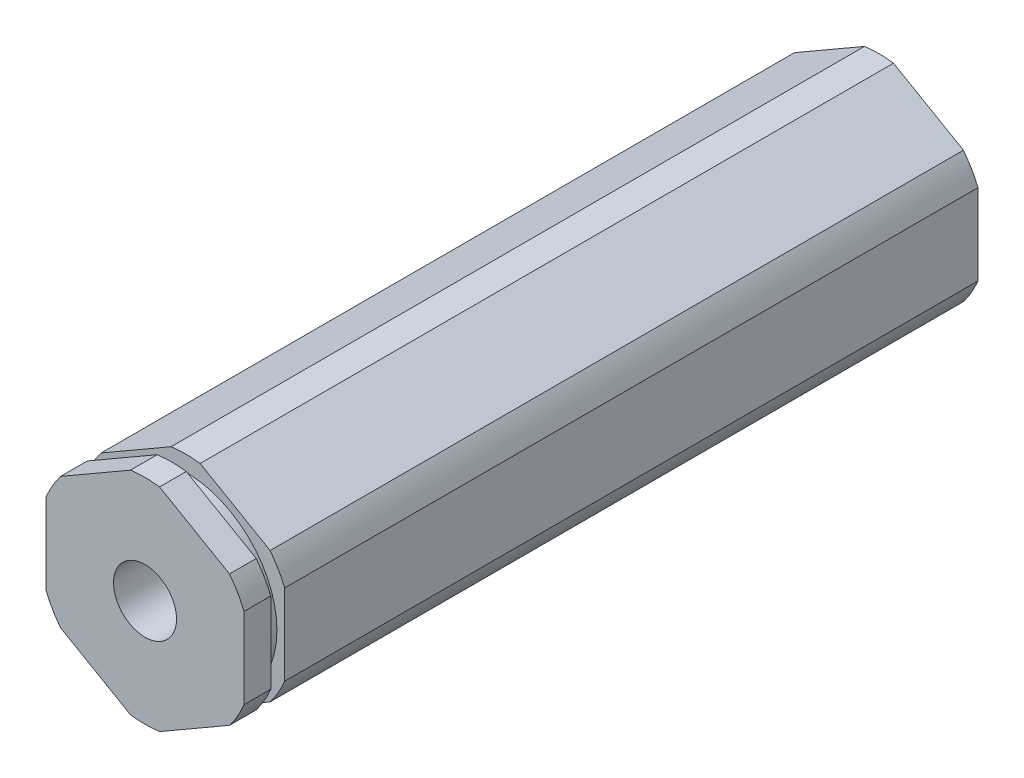
ISO-10303-21;
HEADER;
FILE_DESCRIPTION(('STEP AP214'),'2;1');
FILE_NAME('part.step','',(''),(''),'','','');
FILE_SCHEMA(('AUTOMOTIVE_DESIGN { 1 0 10303 214 1 1 1 1 }'));
ENDSEC;
DATA;
#1=APPLICATION_CONTEXT('core data for automotive mechanical design processes');
#2=APPLICATION_PROTOCOL_DEFINITION('international standard','automotive_design',2000,#1);
#3=PRODUCT_CONTEXT('',#1,'mechanical');
#4=PRODUCT('Part','Part','',(#3));
#5=PRODUCT_RELATED_PRODUCT_CATEGORY('part','',(#4));
#6=PRODUCT_DEFINITION_FORMATION('','',#4);
#7=PRODUCT_DEFINITION_CONTEXT('part definition',#1,'design');
#8=PRODUCT_DEFINITION('design','',#6,#7);
#9=PRODUCT_DEFINITION_SHAPE('','',#8);
#10=(LENGTH_UNIT() NAMED_UNIT(*) SI_UNIT(.MILLI.,.METRE.));
#11=(NAMED_UNIT(*) PLANE_ANGLE_UNIT() SI_UNIT($,.RADIAN.));
#12=(NAMED_UNIT(*) SI_UNIT($,.STERADIAN.) SOLID_ANGLE_UNIT());
#13=UNCERTAINTY_MEASURE_WITH_UNIT(LENGTH_MEASURE(1.E-05),#10,'distance_accuracy_value','');
#14=(GEOMETRIC_REPRESENTATION_CONTEXT(3) GLOBAL_UNCERTAINTY_ASSIGNED_CONTEXT((#13)) GLOBAL_UNIT_ASSIGNED_CONTEXT((#10,
#11,#12)) REPRESENTATION_CONTEXT('',''));
#15=CARTESIAN_POINT('',(0.,0.,0.));
#16=DIRECTION('',(0.,0.,1.));
#17=DIRECTION('',(1.,0.,0.));
#18=AXIS2_PLACEMENT_3D('',#15,#16,#17);
#19=CARTESIAN_POINT('',(6.35,0.,23.5331));
#20=DIRECTION('',(-1.,0.,0.));
#21=DIRECTION('',(0.,-1.,0.));
#22=AXIS2_PLACEMENT_3D('',#19,#20,#21);
#23=PLANE('',#22);
#24=DIRECTION('',(0.,-1.,0.));
#25=VECTOR('',#24,1.);
#26=CARTESIAN_POINT('',(6.35,0.,21.8186));
#27=LINE('',#26,#25);
#28=CARTESIAN_POINT('',(6.35,2.59030191290513,21.8186));
#29=VERTEX_POINT('',#28);
#30=CARTESIAN_POINT('',(6.35,-2.59030191290513,21.8186));
#31=VERTEX_POINT('',#30);
#32=EDGE_CURVE('E80',#29,#31,#27,.T.);
#33=ORIENTED_EDGE('',*,*,#32,.F.);
#34=DIRECTION('',(0.,0.,-1.));
#35=VECTOR('',#34,1.);
#36=CARTESIAN_POINT('',(6.35,2.59030191290513,23.5331));
#37=LINE('',#36,#35);
#38=CARTESIAN_POINT('',(6.35,2.59030191290513,23.5331));
#39=VERTEX_POINT('',#38);
#40=EDGE_CURVE('E251',#39,#29,#37,.T.);
#41=ORIENTED_EDGE('',*,*,#40,.F.);
#42=DIRECTION('',(0.,1.,0.));
#43=VECTOR('',#42,1.);
#44=CARTESIAN_POINT('',(6.35,0.,23.5331));
#45=LINE('',#44,#43);
#46=CARTESIAN_POINT('',(6.35,-2.59030191290513,23.5331));
#47=VERTEX_POINT('',#46);
#48=EDGE_CURVE('E365',#47,#39,#45,.T.);
#49=ORIENTED_EDGE('',*,*,#48,.F.);
#50=DIRECTION('',(0.,0.,-1.));
#51=VECTOR('',#50,1.);
#52=CARTESIAN_POINT('',(6.35,-2.59030191290513,23.5331));
#53=LINE('',#52,#51);
#54=EDGE_CURVE('E306',#47,#31,#53,.T.);
#55=ORIENTED_EDGE('',*,*,#54,.T.);
#56=EDGE_LOOP('',(#33,#41,#49,#55));
#57=FACE_BOUND('',#56,.T.);
#58=ADVANCED_FACE('F58',(#57),#23,.F.);
#59=CARTESIAN_POINT('',(0.,0.,23.5331));
#60=DIRECTION('',(0.,0.,-1.));
#61=DIRECTION('',(-1.,0.,0.));
#62=AXIS2_PLACEMENT_3D('',#59,#60,#61);
#63=CYLINDRICAL_SURFACE('',#62,6.858);
#64=CARTESIAN_POINT('',(0.,0.,21.8186));
#65=DIRECTION('',(0.,0.,1.));
#66=DIRECTION('',(1.,0.,0.));
#67=AXIS2_PLACEMENT_3D('',#64,#65,#66);
#68=CIRCLE('',#67,6.858);
#69=CARTESIAN_POINT('',(5.41826726004727,4.20411035757862,21.8186));
#70=VERTEX_POINT('',#69);
#71=EDGE_CURVE('E420',#29,#70,#68,.T.);
#72=ORIENTED_EDGE('',*,*,#71,.T.);
#73=DIRECTION('',(0.,0.,-1.));
#74=VECTOR('',#73,1.);
#75=CARTESIAN_POINT('',(5.41826726004727,4.20411035757862,23.5331));
#76=LINE('',#75,#74);
#77=CARTESIAN_POINT('',(5.41826726004727,4.20411035757862,23.5331));
#78=VERTEX_POINT('',#77);
#79=EDGE_CURVE('E252',#78,#70,#76,.T.);
#80=ORIENTED_EDGE('',*,*,#79,.F.);
#81=CARTESIAN_POINT('',(0.,0.,23.5331));
#82=DIRECTION('',(0.,0.,1.));
#83=DIRECTION('',(1.,0.,0.));
#84=AXIS2_PLACEMENT_3D('',#81,#82,#83);
#85=CIRCLE('',#84,6.858);
#86=EDGE_CURVE('E362',#39,#78,#85,.T.);
#87=ORIENTED_EDGE('',*,*,#86,.F.);
#88=ORIENTED_EDGE('',*,*,#40,.T.);
#89=EDGE_LOOP('',(#72,#80,#87,#88));
#90=FACE_BOUND('',#89,.T.);
#91=ADVANCED_FACE('F550',(#90),#63,.T.);
#92=CARTESIAN_POINT('',(3.175,5.49926131403119,23.5331));
#93=DIRECTION('',(-0.5,-0.866025403784439,0.));
#94=DIRECTION('',(0.866025403784439,-0.5,0.));
#95=AXIS2_PLACEMENT_3D('',#92,#93,#94);
#96=PLANE('',#95);
#97=DIRECTION('',(0.866025403784439,-0.5,0.));
#98=VECTOR('',#97,1.);
#99=CARTESIAN_POINT('',(3.175,5.49926131403119,21.8186));
#100=LINE('',#99,#98);
#101=CARTESIAN_POINT('',(0.931732739952733,6.79441227048375,21.8186));
#102=VERTEX_POINT('',#101);
#103=EDGE_CURVE('E386',#102,#70,#100,.T.);
#104=ORIENTED_EDGE('',*,*,#103,.F.);
#105=DIRECTION('',(0.,0.,-1.));
#106=VECTOR('',#105,1.);
#107=CARTESIAN_POINT('',(0.931732739952733,6.79441227048375,23.5331));
#108=LINE('',#107,#106);
#109=CARTESIAN_POINT('',(0.931732739952733,6.79441227048375,23.5331));
#110=VERTEX_POINT('',#109);
#111=EDGE_CURVE('E261',#110,#102,#108,.T.);
#112=ORIENTED_EDGE('',*,*,#111,.F.);
#113=DIRECTION('',(-0.866025403784439,0.5,0.));
#114=VECTOR('',#113,1.);
#115=CARTESIAN_POINT('',(3.175,5.49926131403119,23.5331));
#116=LINE('',#115,#114);
#117=EDGE_CURVE('E359',#78,#110,#116,.T.);
#118=ORIENTED_EDGE('',*,*,#117,.F.);
#119=ORIENTED_EDGE('',*,*,#79,.T.);
#120=EDGE_LOOP('',(#104,#112,#118,#119));
#121=FACE_BOUND('',#120,.T.);
#122=ADVANCED_FACE('F562',(#121),#96,.F.);
#123=CARTESIAN_POINT('',(-0.931732739952733,6.79441227048375,21.8186));
#124=VERTEX_POINT('',#123);
#125=EDGE_CURVE('E423',#102,#124,#68,.T.);
#126=ORIENTED_EDGE('',*,*,#125,.T.);
#127=DIRECTION('',(0.,0.,-1.));
#128=VECTOR('',#127,1.);
#129=CARTESIAN_POINT('',(-0.931732739952731,6.79441227048375,23.5331));
#130=LINE('',#129,#128);
#131=CARTESIAN_POINT('',(-0.931732739952731,6.79441227048375,23.5331));
#132=VERTEX_POINT('',#131);
#133=EDGE_CURVE('E266',#132,#124,#130,.T.);
#134=ORIENTED_EDGE('',*,*,#133,.F.);
#135=EDGE_CURVE('E358',#110,#132,#85,.T.);
#136=ORIENTED_EDGE('',*,*,#135,.F.);
#137=ORIENTED_EDGE('',*,*,#111,.T.);
#138=EDGE_LOOP('',(#126,#134,#136,#137));
#139=FACE_BOUND('',#138,.T.);
#140=ADVANCED_FACE('F567',(#139),#63,.T.);
#141=CARTESIAN_POINT('',(-3.175,5.49926131403119,23.5331));
#142=DIRECTION('',(0.5,-0.866025403784439,0.));
#143=DIRECTION('',(0.866025403784439,0.5,0.));
#144=AXIS2_PLACEMENT_3D('',#141,#142,#143);
#145=PLANE('',#144);
#146=DIRECTION('',(0.866025403784439,0.5,0.));
#147=VECTOR('',#146,1.);
#148=CARTESIAN_POINT('',(-3.175,5.49926131403119,21.8186));
#149=LINE('',#148,#147);
#150=CARTESIAN_POINT('',(-5.41826726004727,4.20411035757862,21.8186));
#151=VERTEX_POINT('',#150);
#152=EDGE_CURVE('E389',#151,#124,#149,.T.);
#153=ORIENTED_EDGE('',*,*,#152,.F.);
#154=DIRECTION('',(0.,0.,-1.));
#155=VECTOR('',#154,1.);
#156=CARTESIAN_POINT('',(-5.41826726004727,4.20411035757862,23.5331));
#157=LINE('',#156,#155);
#158=CARTESIAN_POINT('',(-5.41826726004727,4.20411035757862,23.5331));
#159=VERTEX_POINT('',#158);
#160=EDGE_CURVE('E271',#159,#151,#157,.T.);
#161=ORIENTED_EDGE('',*,*,#160,.F.);
#162=DIRECTION('',(-0.866025403784439,-0.5,0.));
#163=VECTOR('',#162,1.);
#164=CARTESIAN_POINT('',(-3.175,5.49926131403119,23.5331));
#165=LINE('',#164,#163);
#166=EDGE_CURVE('E355',#132,#159,#165,.T.);
#167=ORIENTED_EDGE('',*,*,#166,.F.);
#168=ORIENTED_EDGE('',*,*,#133,.T.);
#169=EDGE_LOOP('',(#153,#161,#167,#168));
#170=FACE_BOUND('',#169,.T.);
#171=ADVANCED_FACE('F572',(#170),#145,.F.);
#172=CARTESIAN_POINT('',(-6.35,2.59030191290514,21.8186));
#173=VERTEX_POINT('',#172);
#174=EDGE_CURVE('E431',#151,#173,#68,.T.);
#175=ORIENTED_EDGE('',*,*,#174,.T.);
#176=DIRECTION('',(0.,0.,-1.));
#177=VECTOR('',#176,1.);
#178=CARTESIAN_POINT('',(-6.35,2.59030191290514,23.5331));
#179=LINE('',#178,#177);
#180=CARTESIAN_POINT('',(-6.35,2.59030191290514,23.5331));
#181=VERTEX_POINT('',#180);
#182=EDGE_CURVE('E276',#181,#173,#179,.T.);
#183=ORIENTED_EDGE('',*,*,#182,.F.);
#184=EDGE_CURVE('E354',#159,#181,#85,.T.);
#185=ORIENTED_EDGE('',*,*,#184,.F.);
#186=ORIENTED_EDGE('',*,*,#160,.T.);
#187=EDGE_LOOP('',(#175,#183,#185,#186));
#188=FACE_BOUND('',#187,.T.);
#189=ADVANCED_FACE('F445',(#188),#63,.T.);
#190=CARTESIAN_POINT('',(-6.35,0.,23.5331));
#191=DIRECTION('',(1.,0.,0.));
#192=DIRECTION('',(0.,1.,0.));
#193=AXIS2_PLACEMENT_3D('',#190,#191,#192);
#194=PLANE('',#193);
#195=DIRECTION('',(0.,1.,0.));
#196=VECTOR('',#195,1.);
#197=CARTESIAN_POINT('',(-6.35,0.,21.8186));
#198=LINE('',#197,#196);
#199=CARTESIAN_POINT('',(-6.35,-2.59030191290514,21.8186));
#200=VERTEX_POINT('',#199);
#201=EDGE_CURVE('E392',#200,#173,#198,.T.);
#202=ORIENTED_EDGE('',*,*,#201,.F.);
#203=DIRECTION('',(0.,0.,-1.));
#204=VECTOR('',#203,1.);
#205=CARTESIAN_POINT('',(-6.35,-2.59030191290514,23.5331));
#206=LINE('',#205,#204);
#207=CARTESIAN_POINT('',(-6.35,-2.59030191290514,23.5331));
#208=VERTEX_POINT('',#207);
#209=EDGE_CURVE('E281',#208,#200,#206,.T.);
#210=ORIENTED_EDGE('',*,*,#209,.F.);
#211=DIRECTION('',(0.,-1.,0.));
#212=VECTOR('',#211,1.);
#213=CARTESIAN_POINT('',(-6.35,0.,23.5331));
#214=LINE('',#213,#212);
#215=EDGE_CURVE('E351',#181,#208,#214,.T.);
#216=ORIENTED_EDGE('',*,*,#215,.F.);
#217=ORIENTED_EDGE('',*,*,#182,.T.);
#218=EDGE_LOOP('',(#202,#210,#216,#217));
#219=FACE_BOUND('',#218,.T.);
#220=ADVANCED_FACE('F452',(#219),#194,.F.);
#221=CARTESIAN_POINT('',(-5.41826726004728,-4.20411035757861,21.8186));
#222=VERTEX_POINT('',#221);
#223=EDGE_CURVE('E434',#200,#222,#68,.T.);
#224=ORIENTED_EDGE('',*,*,#223,.T.);
#225=DIRECTION('',(0.,0.,-1.));
#226=VECTOR('',#225,1.);
#227=CARTESIAN_POINT('',(-5.41826726004728,-4.20411035757862,23.5331));
#228=LINE('',#227,#226);
#229=CARTESIAN_POINT('',(-5.41826726004728,-4.20411035757862,23.5331));
#230=VERTEX_POINT('',#229);
#231=EDGE_CURVE('E286',#230,#222,#228,.T.);
#232=ORIENTED_EDGE('',*,*,#231,.F.);
#233=EDGE_CURVE('E350',#208,#230,#85,.T.);
#234=ORIENTED_EDGE('',*,*,#233,.F.);
#235=ORIENTED_EDGE('',*,*,#209,.T.);
#236=EDGE_LOOP('',(#224,#232,#234,#235));
#237=FACE_BOUND('',#236,.T.);
#238=ADVANCED_FACE('F541',(#237),#63,.T.);
#239=CARTESIAN_POINT('',(-3.175,-5.49926131403118,23.5331));
#240=DIRECTION('',(0.5,0.866025403784439,0.));
#241=DIRECTION('',(-0.866025403784439,0.5,0.));
#242=AXIS2_PLACEMENT_3D('',#239,#240,#241);
#243=PLANE('',#242);
#244=DIRECTION('',(-0.866025403784439,0.5,0.));
#245=VECTOR('',#244,1.);
#246=CARTESIAN_POINT('',(-3.175,-5.49926131403118,21.8186));
#247=LINE('',#246,#245);
#248=CARTESIAN_POINT('',(-0.931732739952721,-6.79441227048375,21.8186));
#249=VERTEX_POINT('',#248);
#250=EDGE_CURVE('E395',#249,#222,#247,.T.);
#251=ORIENTED_EDGE('',*,*,#250,.F.);
#252=DIRECTION('',(0.,0.,-1.));
#253=VECTOR('',#252,1.);
#254=CARTESIAN_POINT('',(-0.931732739952721,-6.79441227048375,23.5331));
#255=LINE('',#254,#253);
#256=CARTESIAN_POINT('',(-0.931732739952721,-6.79441227048375,23.5331));
#257=VERTEX_POINT('',#256);
#258=EDGE_CURVE('E291',#257,#249,#255,.T.);
#259=ORIENTED_EDGE('',*,*,#258,.F.);
#260=DIRECTION('',(0.866025403784439,-0.5,0.));
#261=VECTOR('',#260,1.);
#262=CARTESIAN_POINT('',(-3.175,-5.49926131403118,23.5331));
#263=LINE('',#262,#261);
#264=EDGE_CURVE('E347',#230,#257,#263,.T.);
#265=ORIENTED_EDGE('',*,*,#264,.F.);
#266=ORIENTED_EDGE('',*,*,#231,.T.);
#267=EDGE_LOOP('',(#251,#259,#265,#266));
#268=FACE_BOUND('',#267,.T.);
#269=ADVANCED_FACE('F549',(#268),#243,.F.);
#270=CARTESIAN_POINT('',(0.931732739952728,-6.79441227048375,21.8186));
#271=VERTEX_POINT('',#270);
#272=EDGE_CURVE('E424',#249,#271,#68,.T.);
#273=ORIENTED_EDGE('',*,*,#272,.T.);
#274=DIRECTION('',(0.,0.,-1.));
#275=VECTOR('',#274,1.);
#276=CARTESIAN_POINT('',(0.931732739952731,-6.79441227048375,23.5331));
#277=LINE('',#276,#275);
#278=CARTESIAN_POINT('',(0.931732739952731,-6.79441227048375,23.5331));
#279=VERTEX_POINT('',#278);
#280=EDGE_CURVE('E296',#279,#271,#277,.T.);
#281=ORIENTED_EDGE('',*,*,#280,.F.);
#282=EDGE_CURVE('E346',#257,#279,#85,.T.);
#283=ORIENTED_EDGE('',*,*,#282,.F.);
#284=ORIENTED_EDGE('',*,*,#258,.T.);
#285=EDGE_LOOP('',(#273,#281,#283,#284));
#286=FACE_BOUND('',#285,.T.);
#287=ADVANCED_FACE('F540',(#286),#63,.T.);
#288=CARTESIAN_POINT('',(3.175,-5.49926131403118,23.5331));
#289=DIRECTION('',(-0.5,0.866025403784439,0.));
#290=DIRECTION('',(-0.866025403784439,-0.5,0.));
#291=AXIS2_PLACEMENT_3D('',#288,#289,#290);
#292=PLANE('',#291);
#293=DIRECTION('',(-0.866025403784439,-0.5,0.));
#294=VECTOR('',#293,1.);
#295=CARTESIAN_POINT('',(3.175,-5.49926131403118,21.8186));
#296=LINE('',#295,#294);
#297=CARTESIAN_POINT('',(5.41826726004727,-4.20411035757862,21.8186));
#298=VERTEX_POINT('',#297);
#299=EDGE_CURVE('E231',#298,#271,#296,.T.);
#300=ORIENTED_EDGE('',*,*,#299,.F.);
#301=DIRECTION('',(0.,0.,-1.));
#302=VECTOR('',#301,1.);
#303=CARTESIAN_POINT('',(5.41826726004727,-4.20411035757862,23.5331));
#304=LINE('',#303,#302);
#305=CARTESIAN_POINT('',(5.41826726004727,-4.20411035757862,23.5331));
#306=VERTEX_POINT('',#305);
#307=EDGE_CURVE('E301',#306,#298,#304,.T.);
#308=ORIENTED_EDGE('',*,*,#307,.F.);
#309=DIRECTION('',(0.866025403784439,0.5,0.));
#310=VECTOR('',#309,1.);
#311=CARTESIAN_POINT('',(3.175,-5.49926131403118,23.5331));
#312=LINE('',#311,#310);
#313=EDGE_CURVE('E342',#279,#306,#312,.T.);
#314=ORIENTED_EDGE('',*,*,#313,.F.);
#315=ORIENTED_EDGE('',*,*,#280,.T.);
#316=EDGE_LOOP('',(#300,#308,#314,#315));
#317=FACE_BOUND('',#316,.T.);
#318=ADVANCED_FACE('F554',(#317),#292,.F.);
#319=CARTESIAN_POINT('',(0.,0.,21.8186));
#320=DIRECTION('',(0.,0.,-1.));
#321=DIRECTION('',(-1.,0.,0.));
#322=AXIS2_PLACEMENT_3D('',#319,#320,#321);
#323=CIRCLE('',#322,6.858);
#324=EDGE_CURVE('E11',#31,#298,#323,.T.);
#325=ORIENTED_EDGE('',*,*,#324,.F.);
#326=ORIENTED_EDGE('',*,*,#54,.F.);
#327=EDGE_CURVE('E345',#306,#47,#85,.T.);
#328=ORIENTED_EDGE('',*,*,#327,.F.);
#329=ORIENTED_EDGE('',*,*,#307,.T.);
#330=EDGE_LOOP('',(#325,#326,#328,#329));
#331=FACE_BOUND('',#330,.T.);
#332=ADVANCED_FACE('F683',(#331),#63,.T.);
#333=CARTESIAN_POINT('',(0.,0.,23.5331));
#334=DIRECTION('',(0.,0.,1.));
#335=DIRECTION('',(1.,0.,0.));
#336=AXIS2_PLACEMENT_3D('',#333,#334,#335);
#337=PLANE('',#336);
#338=CARTESIAN_POINT('',(0.,0.,23.5331));
#339=DIRECTION('',(0.,0.,1.));
#340=DIRECTION('',(1.,0.,0.));
#341=AXIS2_PLACEMENT_3D('',#338,#339,#340);
#342=CIRCLE('',#341,2.01929999999999);
#343=CARTESIAN_POINT('',(2.01929999999999,0.,23.5331));
#344=VERTEX_POINT('',#343);
#345=EDGE_CURVE('E380',#344,#344,#342,.T.);
#346=ORIENTED_EDGE('',*,*,#345,.F.);
#347=EDGE_LOOP('',(#346));
#348=FACE_BOUND('',#347,.T.);
#349=ORIENTED_EDGE('',*,*,#48,.T.);
#350=ORIENTED_EDGE('',*,*,#86,.T.);
#351=ORIENTED_EDGE('',*,*,#117,.T.);
#352=ORIENTED_EDGE('',*,*,#135,.T.);
#353=ORIENTED_EDGE('',*,*,#166,.T.);
#354=ORIENTED_EDGE('',*,*,#184,.T.);
#355=ORIENTED_EDGE('',*,*,#215,.T.);
#356=ORIENTED_EDGE('',*,*,#233,.T.);
#357=ORIENTED_EDGE('',*,*,#264,.T.);
#358=ORIENTED_EDGE('',*,*,#282,.T.);
#359=ORIENTED_EDGE('',*,*,#313,.T.);
#360=ORIENTED_EDGE('',*,*,#327,.T.);
#361=EDGE_LOOP('',(#349,#350,#351,#352,#353,#354,#355,#356,#357,#358,#359,#360));
#362=FACE_BOUND('',#361,.T.);
#363=ADVANCED_FACE('F456',(#348,#362),#337,.T.);
#364=CARTESIAN_POINT('',(0.,0.,7.18566000000001));
#365=DIRECTION('',(0.,0.,1.));
#366=DIRECTION('',(1.,0.,0.));
#367=AXIS2_PLACEMENT_3D('',#364,#365,#366);
#368=CONICAL_SURFACE('',#367,2.01929999999999,1.02974425867665);
#369=CARTESIAN_POINT('',(0.,0.,5.97234215199765));
#370=VERTEX_POINT('',#369);
#371=VERTEX_LOOP('',#370);
#372=FACE_BOUND('',#371,.T.);
#373=CARTESIAN_POINT('',(0.,0.,7.18566000000001));
#374=DIRECTION('',(0.,0.,1.));
#375=DIRECTION('',(1.,0.,0.));
#376=AXIS2_PLACEMENT_3D('',#373,#374,#375);
#377=CIRCLE('',#376,2.01929999999999);
#378=CARTESIAN_POINT('',(2.01929999999999,0.,7.18566000000001));
#379=VERTEX_POINT('',#378);
#380=EDGE_CURVE('E376',#379,#379,#377,.T.);
#381=ORIENTED_EDGE('',*,*,#380,.T.);
#382=EDGE_LOOP('',(#381));
#383=FACE_BOUND('',#382,.T.);
#384=ADVANCED_FACE('F767',(#372,#383),#368,.F.);
#385=CARTESIAN_POINT('',(0.,0.,23.5331));
#386=DIRECTION('',(0.,0.,1.));
#387=DIRECTION('',(1.,0.,0.));
#388=AXIS2_PLACEMENT_3D('',#385,#386,#387);
#389=CYLINDRICAL_SURFACE('',#388,2.01929999999999);
#390=ORIENTED_EDGE('',*,*,#380,.F.);
#391=EDGE_LOOP('',(#390));
#392=FACE_BOUND('',#391,.T.);
#393=ORIENTED_EDGE('',*,*,#345,.T.);
#394=EDGE_LOOP('',(#393));
#395=FACE_BOUND('',#394,.T.);
#396=ADVANCED_FACE('F655',(#392,#395),#389,.F.);
#397=CARTESIAN_POINT('',(0.,6.858,21.8186));
#398=DIRECTION('',(0.,0.,-1.));
#399=DIRECTION('',(-1.,0.,0.));
#400=AXIS2_PLACEMENT_3D('',#397,#398,#399);
#401=PLANE('',#400);
#402=CARTESIAN_POINT('',(0.,0.,21.8186));
#403=DIRECTION('',(0.,0.,1.));
#404=DIRECTION('',(1.,0.,0.));
#405=AXIS2_PLACEMENT_3D('',#402,#403,#404);
#406=CIRCLE('',#405,5.8547);
#407=CARTESIAN_POINT('',(5.8547,0.,21.8186));
#408=VERTEX_POINT('',#407);
#409=EDGE_CURVE('E413',#408,#408,#406,.T.);
#410=ORIENTED_EDGE('',*,*,#409,.T.);
#411=EDGE_LOOP('',(#410));
#412=FACE_BOUND('',#411,.T.);
#413=ORIENTED_EDGE('',*,*,#32,.T.);
#414=ORIENTED_EDGE('',*,*,#324,.T.);
#415=ORIENTED_EDGE('',*,*,#299,.T.);
#416=ORIENTED_EDGE('',*,*,#272,.F.);
#417=ORIENTED_EDGE('',*,*,#250,.T.);
#418=ORIENTED_EDGE('',*,*,#223,.F.);
#419=ORIENTED_EDGE('',*,*,#201,.T.);
#420=ORIENTED_EDGE('',*,*,#174,.F.);
#421=ORIENTED_EDGE('',*,*,#152,.T.);
#422=ORIENTED_EDGE('',*,*,#125,.F.);
#423=ORIENTED_EDGE('',*,*,#103,.T.);
#424=ORIENTED_EDGE('',*,*,#71,.F.);
#425=EDGE_LOOP('',(#413,#414,#415,#416,#417,#418,#419,#420,#421,#422,#423,#424));
#426=FACE_BOUND('',#425,.T.);
#427=ADVANCED_FACE('F651',(#412,#426),#401,.T.);
#428=CARTESIAN_POINT('',(0.,6.858,20.9296));
#429=DIRECTION('',(0.,0.,1.));
#430=DIRECTION('',(1.,0.,0.));
#431=AXIS2_PLACEMENT_3D('',#428,#429,#430);
#432=PLANE('',#431);
#433=CARTESIAN_POINT('',(0.,0.,20.9296));
#434=DIRECTION('',(0.,0.,1.));
#435=DIRECTION('',(1.,0.,0.));
#436=AXIS2_PLACEMENT_3D('',#433,#434,#435);
#437=CIRCLE('',#436,5.8547);
#438=CARTESIAN_POINT('',(5.8547,0.,20.9296));
#439=VERTEX_POINT('',#438);
#440=EDGE_CURVE('E242',#439,#439,#437,.T.);
#441=ORIENTED_EDGE('',*,*,#440,.F.);
#442=EDGE_LOOP('',(#441));
#443=FACE_BOUND('',#442,.T.);
#444=DIRECTION('',(0.,1.,0.));
#445=VECTOR('',#444,1.);
#446=CARTESIAN_POINT('',(6.35,0.,20.9296));
#447=LINE('',#446,#445);
#448=CARTESIAN_POINT('',(6.35,-2.59030191290513,20.9296));
#449=VERTEX_POINT('',#448);
#450=CARTESIAN_POINT('',(6.35,2.59030191290513,20.9296));
#451=VERTEX_POINT('',#450);
#452=EDGE_CURVE('E222',#449,#451,#447,.T.);
#453=ORIENTED_EDGE('',*,*,#452,.T.);
#454=CARTESIAN_POINT('',(0.,0.,20.9296));
#455=DIRECTION('',(0.,0.,1.));
#456=DIRECTION('',(1.,0.,0.));
#457=AXIS2_PLACEMENT_3D('',#454,#455,#456);
#458=CIRCLE('',#457,6.858);
#459=CARTESIAN_POINT('',(5.41826726004727,4.20411035757862,20.9296));
#460=VERTEX_POINT('',#459);
#461=EDGE_CURVE('E225',#451,#460,#458,.T.);
#462=ORIENTED_EDGE('',*,*,#461,.T.);
#463=DIRECTION('',(-0.866025403784439,0.5,0.));
#464=VECTOR('',#463,1.);
#465=CARTESIAN_POINT('',(3.175,5.49926131403119,20.9296));
#466=LINE('',#465,#464);
#467=CARTESIAN_POINT('',(0.931732739952733,6.79441227048375,20.9296));
#468=VERTEX_POINT('',#467);
#469=EDGE_CURVE('E232',#460,#468,#466,.T.);
#470=ORIENTED_EDGE('',*,*,#469,.T.);
#471=CARTESIAN_POINT('',(-0.931732739952733,6.79441227048375,20.9296));
#472=VERTEX_POINT('',#471);
#473=EDGE_CURVE('E243',#468,#472,#458,.T.);
#474=ORIENTED_EDGE('',*,*,#473,.T.);
#475=DIRECTION('',(-0.866025403784439,-0.5,0.));
#476=VECTOR('',#475,1.);
#477=CARTESIAN_POINT('',(-3.175,5.49926131403119,20.9296));
#478=LINE('',#477,#476);
#479=CARTESIAN_POINT('',(-5.41826726004727,4.20411035757862,20.9296));
#480=VERTEX_POINT('',#479);
#481=EDGE_CURVE('E402',#472,#480,#478,.T.);
#482=ORIENTED_EDGE('',*,*,#481,.T.);
#483=CARTESIAN_POINT('',(-6.35,2.59030191290514,20.9296));
#484=VERTEX_POINT('',#483);
#485=EDGE_CURVE('E525',#480,#484,#458,.T.);
#486=ORIENTED_EDGE('',*,*,#485,.T.);
#487=DIRECTION('',(0.,-1.,0.));
#488=VECTOR('',#487,1.);
#489=CARTESIAN_POINT('',(-6.35,0.,20.9296));
#490=LINE('',#489,#488);
#491=CARTESIAN_POINT('',(-6.35,-2.59030191290514,20.9296));
#492=VERTEX_POINT('',#491);
#493=EDGE_CURVE('E405',#484,#492,#490,.T.);
#494=ORIENTED_EDGE('',*,*,#493,.T.);
#495=CARTESIAN_POINT('',(-5.41826726004728,-4.20411035757861,20.9296));
#496=VERTEX_POINT('',#495);
#497=EDGE_CURVE('E429',#492,#496,#458,.T.);
#498=ORIENTED_EDGE('',*,*,#497,.T.);
#499=DIRECTION('',(0.866025403784439,-0.5,0.));
#500=VECTOR('',#499,1.);
#501=CARTESIAN_POINT('',(-3.175,-5.49926131403118,20.9296));
#502=LINE('',#501,#500);
#503=CARTESIAN_POINT('',(-0.931732739952721,-6.79441227048375,20.9296));
#504=VERTEX_POINT('',#503);
#505=EDGE_CURVE('E408',#496,#504,#502,.T.);
#506=ORIENTED_EDGE('',*,*,#505,.T.);
#507=CARTESIAN_POINT('',(0.931732739952728,-6.79441227048375,20.9296));
#508=VERTEX_POINT('',#507);
#509=EDGE_CURVE('E245',#504,#508,#458,.T.);
#510=ORIENTED_EDGE('',*,*,#509,.T.);
#511=DIRECTION('',(0.866025403784439,0.5,0.));
#512=VECTOR('',#511,1.);
#513=CARTESIAN_POINT('',(3.175,-5.49926131403118,20.9296));
#514=LINE('',#513,#512);
#515=CARTESIAN_POINT('',(5.41826726004727,-4.20411035757862,20.9296));
#516=VERTEX_POINT('',#515);
#517=EDGE_CURVE('E73',#508,#516,#514,.T.);
#518=ORIENTED_EDGE('',*,*,#517,.T.);
#519=CARTESIAN_POINT('',(0.,0.,20.9296));
#520=DIRECTION('',(0.,0.,1.));
#521=DIRECTION('',(1.,0.,0.));
#522=AXIS2_PLACEMENT_3D('',#519,#520,#521);
#523=CIRCLE('',#522,6.858);
#524=EDGE_CURVE('E66',#516,#449,#523,.T.);
#525=ORIENTED_EDGE('',*,*,#524,.T.);
#526=EDGE_LOOP('',(#453,#462,#470,#474,#482,#486,#494,#498,#506,#510,#518,#525));
#527=FACE_BOUND('',#526,.T.);
#528=ADVANCED_FACE('F224',(#443,#527),#432,.T.);
#529=CARTESIAN_POINT('',(0.,0.,165.047176272324));
#530=DIRECTION('',(0.,0.,1.));
#531=DIRECTION('',(1.,0.,0.));
#532=AXIS2_PLACEMENT_3D('',#529,#530,#531);
#533=CYLINDRICAL_SURFACE('',#532,5.8547);
#534=ORIENTED_EDGE('',*,*,#440,.T.);
#535=EDGE_LOOP('',(#534));
#536=FACE_BOUND('',#535,.T.);
#537=ORIENTED_EDGE('',*,*,#409,.F.);
#538=EDGE_LOOP('',(#537));
#539=FACE_BOUND('',#538,.T.);
#540=ADVANCED_FACE('F664',(#536,#539),#533,.T.);
#541=CARTESIAN_POINT('',(0.,0.,-7.18566000000001));
#542=DIRECTION('',(0.,0.,-1.));
#543=DIRECTION('',(-1.,0.,0.));
#544=AXIS2_PLACEMENT_3D('',#541,#542,#543);
#545=CONICAL_SURFACE('',#544,2.01929999999999,1.02974425867665);
#546=CARTESIAN_POINT('',(0.,0.,-5.97234215199765));
#547=VERTEX_POINT('',#546);
#548=VERTEX_LOOP('',#547);
#549=FACE_BOUND('',#548,.T.);
#550=CARTESIAN_POINT('',(0.,0.,-7.18566000000001));
#551=DIRECTION('',(0.,0.,-1.));
#552=DIRECTION('',(-1.,0.,0.));
#553=AXIS2_PLACEMENT_3D('',#550,#551,#552);
#554=CIRCLE('',#553,2.01929999999999);
#555=CARTESIAN_POINT('',(-2.01929999999999,0.,-7.18566000000001));
#556=VERTEX_POINT('',#555);
#557=EDGE_CURVE('E341',#556,#556,#554,.T.);
#558=ORIENTED_EDGE('',*,*,#557,.T.);
#559=EDGE_LOOP('',(#558));
#560=FACE_BOUND('',#559,.T.);
#561=ADVANCED_FACE('F672',(#549,#560),#545,.F.);
#562=CARTESIAN_POINT('',(0.,0.,-23.5331));
#563=DIRECTION('',(0.,0.,-1.));
#564=DIRECTION('',(-1.,0.,0.));
#565=AXIS2_PLACEMENT_3D('',#562,#563,#564);
#566=CYLINDRICAL_SURFACE('',#565,2.01929999999999);
#567=ORIENTED_EDGE('',*,*,#557,.F.);
#568=EDGE_LOOP('',(#567));
#569=FACE_BOUND('',#568,.T.);
#570=CARTESIAN_POINT('',(0.,0.,-23.5331));
#571=DIRECTION('',(0.,0.,-1.));
#572=DIRECTION('',(-1.,0.,0.));
#573=AXIS2_PLACEMENT_3D('',#570,#571,#572);
#574=CIRCLE('',#573,2.01929999999999);
#575=CARTESIAN_POINT('',(-2.01929999999999,0.,-23.5331));
#576=VERTEX_POINT('',#575);
#577=EDGE_CURVE('E372',#576,#576,#574,.T.);
#578=ORIENTED_EDGE('',*,*,#577,.T.);
#579=EDGE_LOOP('',(#578));
#580=FACE_BOUND('',#579,.T.);
#581=ADVANCED_FACE('F784',(#569,#580),#566,.F.);
#582=CARTESIAN_POINT('',(0.,0.,-23.5331));
#583=DIRECTION('',(0.,0.,1.));
#584=DIRECTION('',(1.,0.,0.));
#585=AXIS2_PLACEMENT_3D('',#582,#583,#584);
#586=PLANE('',#585);
#587=ORIENTED_EDGE('',*,*,#577,.F.);
#588=EDGE_LOOP('',(#587));
#589=FACE_BOUND('',#588,.T.);
#590=DIRECTION('',(0.,1.,0.));
#591=VECTOR('',#590,1.);
#592=CARTESIAN_POINT('',(6.35,0.,-23.5331));
#593=LINE('',#592,#591);
#594=CARTESIAN_POINT('',(6.35,-2.59030191290513,-23.5331));
#595=VERTEX_POINT('',#594);
#596=CARTESIAN_POINT('',(6.35,2.59030191290513,-23.5331));
#597=VERTEX_POINT('',#596);
#598=EDGE_CURVE('E249',#595,#597,#593,.T.);
#599=ORIENTED_EDGE('',*,*,#598,.F.);
#600=CARTESIAN_POINT('',(0.,0.,-23.5331));
#601=DIRECTION('',(0.,0.,1.));
#602=DIRECTION('',(1.,0.,0.));
#603=AXIS2_PLACEMENT_3D('',#600,#601,#602);
#604=CIRCLE('',#603,6.858);
#605=CARTESIAN_POINT('',(5.41826726004727,-4.20411035757862,-23.5331));
#606=VERTEX_POINT('',#605);
#607=EDGE_CURVE('E315',#606,#595,#604,.T.);
#608=ORIENTED_EDGE('',*,*,#607,.F.);
#609=DIRECTION('',(0.866025403784439,0.5,0.));
#610=VECTOR('',#609,1.);
#611=CARTESIAN_POINT('',(3.175,-5.49926131403118,-23.5331));
#612=LINE('',#611,#610);
#613=CARTESIAN_POINT('',(0.931732739952731,-6.79441227048375,-23.5331));
#614=VERTEX_POINT('',#613);
#615=EDGE_CURVE('E311',#614,#606,#612,.T.);
#616=ORIENTED_EDGE('',*,*,#615,.F.);
#617=CARTESIAN_POINT('',(-0.931732739952721,-6.79441227048375,-23.5331));
#618=VERTEX_POINT('',#617);
#619=EDGE_CURVE('E316',#618,#614,#604,.T.);
#620=ORIENTED_EDGE('',*,*,#619,.F.);
#621=DIRECTION('',(0.866025403784439,-0.5,0.));
#622=VECTOR('',#621,1.);
#623=CARTESIAN_POINT('',(-3.175,-5.49926131403118,-23.5331));
#624=LINE('',#623,#622);
#625=CARTESIAN_POINT('',(-5.41826726004728,-4.20411035757862,-23.5331));
#626=VERTEX_POINT('',#625);
#627=EDGE_CURVE('E317',#626,#618,#624,.T.);
#628=ORIENTED_EDGE('',*,*,#627,.F.);
#629=CARTESIAN_POINT('',(-6.35,-2.59030191290514,-23.5331));
#630=VERTEX_POINT('',#629);
#631=EDGE_CURVE('E321',#630,#626,#604,.T.);
#632=ORIENTED_EDGE('',*,*,#631,.F.);
#633=DIRECTION('',(0.,-1.,0.));
#634=VECTOR('',#633,1.);
#635=CARTESIAN_POINT('',(-6.35,0.,-23.5331));
#636=LINE('',#635,#634);
#637=CARTESIAN_POINT('',(-6.35,2.59030191290514,-23.5331));
#638=VERTEX_POINT('',#637);
#639=EDGE_CURVE('E322',#638,#630,#636,.T.);
#640=ORIENTED_EDGE('',*,*,#639,.F.);
#641=CARTESIAN_POINT('',(-5.41826726004727,4.20411035757862,-23.5331));
#642=VERTEX_POINT('',#641);
#643=EDGE_CURVE('E326',#642,#638,#604,.T.);
#644=ORIENTED_EDGE('',*,*,#643,.F.);
#645=DIRECTION('',(-0.866025403784439,-0.5,0.));
#646=VECTOR('',#645,1.);
#647=CARTESIAN_POINT('',(-3.175,5.49926131403119,-23.5331));
#648=LINE('',#647,#646);
#649=CARTESIAN_POINT('',(-0.931732739952731,6.79441227048375,-23.5331));
#650=VERTEX_POINT('',#649);
#651=EDGE_CURVE('E327',#650,#642,#648,.T.);
#652=ORIENTED_EDGE('',*,*,#651,.F.);
#653=CARTESIAN_POINT('',(0.931732739952733,6.79441227048375,-23.5331));
#654=VERTEX_POINT('',#653);
#655=EDGE_CURVE('E331',#654,#650,#604,.T.);
#656=ORIENTED_EDGE('',*,*,#655,.F.);
#657=DIRECTION('',(-0.866025403784439,0.5,0.));
#658=VECTOR('',#657,1.);
#659=CARTESIAN_POINT('',(3.175,5.49926131403119,-23.5331));
#660=LINE('',#659,#658);
#661=CARTESIAN_POINT('',(5.41826726004727,4.20411035757862,-23.5331));
#662=VERTEX_POINT('',#661);
#663=EDGE_CURVE('E332',#662,#654,#660,.T.);
#664=ORIENTED_EDGE('',*,*,#663,.F.);
#665=EDGE_CURVE('E336',#597,#662,#604,.T.);
#666=ORIENTED_EDGE('',*,*,#665,.F.);
#667=EDGE_LOOP('',(#599,#608,#616,#620,#628,#632,#640,#644,#652,#656,#664,#666));
#668=FACE_BOUND('',#667,.T.);
#669=ADVANCED_FACE('F475',(#589,#668),#586,.F.);
#670=ORIENTED_EDGE('',*,*,#524,.F.);
#671=EDGE_CURVE('E305',#516,#606,#304,.T.);
#672=ORIENTED_EDGE('',*,*,#671,.T.);
#673=ORIENTED_EDGE('',*,*,#607,.T.);
#674=EDGE_CURVE('E310',#449,#595,#53,.T.);
#675=ORIENTED_EDGE('',*,*,#674,.F.);
#676=EDGE_LOOP('',(#670,#672,#673,#675));
#677=FACE_BOUND('',#676,.T.);
#678=ADVANCED_FACE('F470',(#677),#63,.T.);
#679=ORIENTED_EDGE('',*,*,#517,.F.);
#680=EDGE_CURVE('E300',#508,#614,#277,.T.);
#681=ORIENTED_EDGE('',*,*,#680,.T.);
#682=ORIENTED_EDGE('',*,*,#615,.T.);
#683=ORIENTED_EDGE('',*,*,#671,.F.);
#684=EDGE_LOOP('',(#679,#681,#682,#683));
#685=FACE_BOUND('',#684,.T.);
#686=ADVANCED_FACE('F496',(#685),#292,.F.);
#687=ORIENTED_EDGE('',*,*,#509,.F.);
#688=EDGE_CURVE('E295',#504,#618,#255,.T.);
#689=ORIENTED_EDGE('',*,*,#688,.T.);
#690=ORIENTED_EDGE('',*,*,#619,.T.);
#691=ORIENTED_EDGE('',*,*,#680,.F.);
#692=EDGE_LOOP('',(#687,#689,#690,#691));
#693=FACE_BOUND('',#692,.T.);
#694=ADVANCED_FACE('F500',(#693),#63,.T.);
#695=ORIENTED_EDGE('',*,*,#505,.F.);
#696=EDGE_CURVE('E290',#496,#626,#228,.T.);
#697=ORIENTED_EDGE('',*,*,#696,.T.);
#698=ORIENTED_EDGE('',*,*,#627,.T.);
#699=ORIENTED_EDGE('',*,*,#688,.F.);
#700=EDGE_LOOP('',(#695,#697,#698,#699));
#701=FACE_BOUND('',#700,.T.);
#702=ADVANCED_FACE('F535',(#701),#243,.F.);
#703=ORIENTED_EDGE('',*,*,#497,.F.);
#704=EDGE_CURVE('E285',#492,#630,#206,.T.);
#705=ORIENTED_EDGE('',*,*,#704,.T.);
#706=ORIENTED_EDGE('',*,*,#631,.T.);
#707=ORIENTED_EDGE('',*,*,#696,.F.);
#708=EDGE_LOOP('',(#703,#705,#706,#707));
#709=FACE_BOUND('',#708,.T.);
#710=ADVANCED_FACE('F536',(#709),#63,.T.);
#711=ORIENTED_EDGE('',*,*,#493,.F.);
#712=EDGE_CURVE('E280',#484,#638,#179,.T.);
#713=ORIENTED_EDGE('',*,*,#712,.T.);
#714=ORIENTED_EDGE('',*,*,#639,.T.);
#715=ORIENTED_EDGE('',*,*,#704,.F.);
#716=EDGE_LOOP('',(#711,#713,#714,#715));
#717=FACE_BOUND('',#716,.T.);
#718=ADVANCED_FACE('F538',(#717),#194,.F.);
#719=ORIENTED_EDGE('',*,*,#485,.F.);
#720=EDGE_CURVE('E275',#480,#642,#157,.T.);
#721=ORIENTED_EDGE('',*,*,#720,.T.);
#722=ORIENTED_EDGE('',*,*,#643,.T.);
#723=ORIENTED_EDGE('',*,*,#712,.F.);
#724=EDGE_LOOP('',(#719,#721,#722,#723));
#725=FACE_BOUND('',#724,.T.);
#726=ADVANCED_FACE('F527',(#725),#63,.T.);
#727=ORIENTED_EDGE('',*,*,#481,.F.);
#728=EDGE_CURVE('E270',#472,#650,#130,.T.);
#729=ORIENTED_EDGE('',*,*,#728,.T.);
#730=ORIENTED_EDGE('',*,*,#651,.T.);
#731=ORIENTED_EDGE('',*,*,#720,.F.);
#732=EDGE_LOOP('',(#727,#729,#730,#731));
#733=FACE_BOUND('',#732,.T.);
#734=ADVANCED_FACE('F523',(#733),#145,.F.);
#735=ORIENTED_EDGE('',*,*,#473,.F.);
#736=EDGE_CURVE('E265',#468,#654,#108,.T.);
#737=ORIENTED_EDGE('',*,*,#736,.T.);
#738=ORIENTED_EDGE('',*,*,#655,.T.);
#739=ORIENTED_EDGE('',*,*,#728,.F.);
#740=EDGE_LOOP('',(#735,#737,#738,#739));
#741=FACE_BOUND('',#740,.T.);
#742=ADVANCED_FACE('F519',(#741),#63,.T.);
#743=ORIENTED_EDGE('',*,*,#469,.F.);
#744=EDGE_CURVE('E240',#460,#662,#76,.T.);
#745=ORIENTED_EDGE('',*,*,#744,.T.);
#746=ORIENTED_EDGE('',*,*,#663,.T.);
#747=ORIENTED_EDGE('',*,*,#736,.F.);
#748=EDGE_LOOP('',(#743,#745,#746,#747));
#749=FACE_BOUND('',#748,.T.);
#750=ADVANCED_FACE('F482',(#749),#96,.F.);
#751=ORIENTED_EDGE('',*,*,#461,.F.);
#752=EDGE_CURVE('E238',#451,#597,#37,.T.);
#753=ORIENTED_EDGE('',*,*,#752,.T.);
#754=ORIENTED_EDGE('',*,*,#665,.T.);
#755=ORIENTED_EDGE('',*,*,#744,.F.);
#756=EDGE_LOOP('',(#751,#753,#754,#755));
#757=FACE_BOUND('',#756,.T.);
#758=ADVANCED_FACE('F236',(#757),#63,.T.);
#759=ORIENTED_EDGE('',*,*,#452,.F.);
#760=ORIENTED_EDGE('',*,*,#674,.T.);
#761=ORIENTED_EDGE('',*,*,#598,.T.);
#762=ORIENTED_EDGE('',*,*,#752,.F.);
#763=EDGE_LOOP('',(#759,#760,#761,#762));
#764=FACE_BOUND('',#763,.T.);
#765=ADVANCED_FACE('F247',(#764),#23,.F.);
#766=CLOSED_SHELL('',(#58,#91,#122,#140,#171,#189,#220,#238,#269,#287,#318,#332,#363,#384,#396,
#427,#528,#540,#561,#581,#669,#678,#686,#694,#702,#710,#718,#726,#734,#742,#750,#758,#765));
#767=MANIFOLD_SOLID_BREP('B2',#766);
#768=ADVANCED_BREP_SHAPE_REPRESENTATION('',(#18,#767),#14);
#769=SHAPE_DEFINITION_REPRESENTATION(#9,#768);
ENDSEC;
END-ISO-10303-21;
